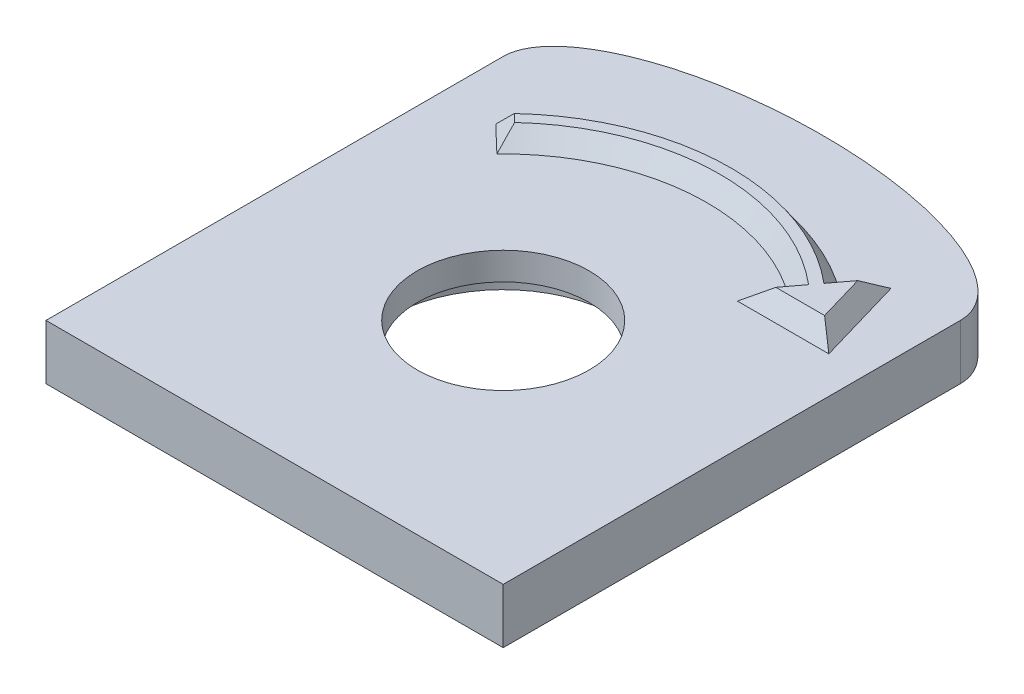
ISO-10303-21;
HEADER;
FILE_DESCRIPTION(('STEP AP214'),'2;1');
FILE_NAME('part.step','',(''),(''),'','','');
FILE_SCHEMA(('AUTOMOTIVE_DESIGN { 1 0 10303 214 1 1 1 1 }'));
ENDSEC;
DATA;
#1=APPLICATION_CONTEXT('core data for automotive mechanical design processes');
#2=APPLICATION_PROTOCOL_DEFINITION('international standard','automotive_design',2000,#1);
#3=PRODUCT_CONTEXT('',#1,'mechanical');
#4=PRODUCT('Part','Part','',(#3));
#5=PRODUCT_RELATED_PRODUCT_CATEGORY('part','',(#4));
#6=PRODUCT_DEFINITION_FORMATION('','',#4);
#7=PRODUCT_DEFINITION_CONTEXT('part definition',#1,'design');
#8=PRODUCT_DEFINITION('design','',#6,#7);
#9=PRODUCT_DEFINITION_SHAPE('','',#8);
#10=(LENGTH_UNIT() NAMED_UNIT(*) SI_UNIT(.MILLI.,.METRE.));
#11=(NAMED_UNIT(*) PLANE_ANGLE_UNIT() SI_UNIT($,.RADIAN.));
#12=(NAMED_UNIT(*) SI_UNIT($,.STERADIAN.) SOLID_ANGLE_UNIT());
#13=UNCERTAINTY_MEASURE_WITH_UNIT(LENGTH_MEASURE(1.E-05),#10,'distance_accuracy_value','');
#14=(GEOMETRIC_REPRESENTATION_CONTEXT(3) GLOBAL_UNCERTAINTY_ASSIGNED_CONTEXT((#13)) GLOBAL_UNIT_ASSIGNED_CONTEXT((#10,
#11,#12)) REPRESENTATION_CONTEXT('',''));
#15=CARTESIAN_POINT('',(0.,0.,0.));
#16=DIRECTION('',(0.,0.,1.));
#17=DIRECTION('',(1.,0.,0.));
#18=AXIS2_PLACEMENT_3D('',#15,#16,#17);
#19=CARTESIAN_POINT('',(-0.231958762886595,3.,2.60309278350516));
#20=DIRECTION('',(0.,-1.,0.));
#21=DIRECTION('',(0.,0.,-1.));
#22=AXIS2_PLACEMENT_3D('',#19,#20,#21);
#23=CYLINDRICAL_SURFACE('',#22,4.7);
#24=CARTESIAN_POINT('',(-0.231958762886595,3.,2.60309278350516));
#25=DIRECTION('',(0.,1.,0.));
#26=DIRECTION('',(0.,0.,1.));
#27=AXIS2_PLACEMENT_3D('',#24,#25,#26);
#28=CIRCLE('',#27,4.7);
#29=CARTESIAN_POINT('',(-0.231958762886595,3.,7.30309278350516));
#30=VERTEX_POINT('',#29);
#31=EDGE_CURVE('E180',#30,#30,#28,.T.);
#32=ORIENTED_EDGE('',*,*,#31,.T.);
#33=EDGE_LOOP('',(#32));
#34=FACE_BOUND('',#33,.T.);
#35=CARTESIAN_POINT('',(-0.231958762886595,1.5,2.60309278350516));
#36=DIRECTION('',(0.,-1.,0.));
#37=DIRECTION('',(0.,0.,-1.));
#38=AXIS2_PLACEMENT_3D('',#35,#36,#37);
#39=CIRCLE('',#38,4.7);
#40=CARTESIAN_POINT('',(-0.231958762886595,1.5,-2.09690721649484));
#41=VERTEX_POINT('',#40);
#42=EDGE_CURVE('E52',#41,#41,#39,.T.);
#43=ORIENTED_EDGE('',*,*,#42,.T.);
#44=EDGE_LOOP('',(#43));
#45=FACE_BOUND('',#44,.T.);
#46=ADVANCED_FACE('F47',(#34,#45),#23,.F.);
#47=CARTESIAN_POINT('',(-0.2319587628866,3.,-9.89690721649484));
#48=DIRECTION('',(0.,1.,0.));
#49=DIRECTION('',(0.,0.,1.));
#50=AXIS2_PLACEMENT_3D('',#47,#48,#49);
#51=PLANE('',#50);
#52=CARTESIAN_POINT('',(-0.2319587628866,3.,-9.89690721649484));
#53=DIRECTION('',(0.,1.,0.));
#54=DIRECTION('',(-1.,0.,0.));
#55=AXIS2_PLACEMENT_3D('',#52,#53,#54);
#56=ELLIPSE('',#55,12.5,5.);
#57=CARTESIAN_POINT('',(12.2680412371134,3.,-9.89690721649484));
#58=VERTEX_POINT('',#57);
#59=CARTESIAN_POINT('',(-12.7319587628866,3.,-9.89690721649484));
#60=VERTEX_POINT('',#59);
#61=EDGE_CURVE('E282',#58,#60,#56,.T.);
#62=ORIENTED_EDGE('',*,*,#61,.T.);
#63=DIRECTION('',(0.,0.,1.));
#64=VECTOR('',#63,1.);
#65=CARTESIAN_POINT('',(-12.7319587628866,3.,-9.89690721649484));
#66=LINE('',#65,#64);
#67=CARTESIAN_POINT('',(-12.7319587628866,3.,15.1030927835052));
#68=VERTEX_POINT('',#67);
#69=EDGE_CURVE('E299',#60,#68,#66,.T.);
#70=ORIENTED_EDGE('',*,*,#69,.T.);
#71=DIRECTION('',(1.,0.,0.));
#72=VECTOR('',#71,1.);
#73=CARTESIAN_POINT('',(-12.7319587628866,3.,15.1030927835052));
#74=LINE('',#73,#72);
#75=CARTESIAN_POINT('',(12.2680412371134,3.,15.1030927835052));
#76=VERTEX_POINT('',#75);
#77=EDGE_CURVE('E273',#68,#76,#74,.T.);
#78=ORIENTED_EDGE('',*,*,#77,.T.);
#79=DIRECTION('',(0.,0.,-1.));
#80=VECTOR('',#79,1.);
#81=CARTESIAN_POINT('',(12.2680412371134,3.,-9.89690721649484));
#82=LINE('',#81,#80);
#83=EDGE_CURVE('E290',#76,#58,#82,.T.);
#84=ORIENTED_EDGE('',*,*,#83,.T.);
#85=EDGE_LOOP('',(#62,#70,#78,#84));
#86=FACE_BOUND('',#85,.T.);
#87=ORIENTED_EDGE('',*,*,#31,.F.);
#88=EDGE_LOOP('',(#87));
#89=FACE_BOUND('',#88,.T.);
#90=DIRECTION('',(-0.599999999999999,0.,0.800000000000001));
#91=VECTOR('',#90,1.);
#92=CARTESIAN_POINT('',(1.10103092783505,3.,0.825773195876287));
#93=LINE('',#92,#91);
#94=CARTESIAN_POINT('',(6.45664947319052,3.,-6.31505153126435));
#95=VERTEX_POINT('',#94);
#96=CARTESIAN_POINT('',(5.25664947319052,3.,-4.71505153126435));
#97=VERTEX_POINT('',#96);
#98=EDGE_CURVE('E134',#95,#97,#93,.T.);
#99=ORIENTED_EDGE('',*,*,#98,.F.);
#100=CARTESIAN_POINT('',(-0.231958762886595,3.,2.60309278350516));
#101=DIRECTION('',(0.,1.,0.));
#102=DIRECTION('',(0.,0.,1.));
#103=AXIS2_PLACEMENT_3D('',#100,#101,#102);
#104=CIRCLE('',#103,11.1476803934619);
#105=CARTESIAN_POINT('',(-8.28544035923077,3.,-5.10483899694802));
#106=VERTEX_POINT('',#105);
#107=EDGE_CURVE('E65',#95,#106,#104,.T.);
#108=ORIENTED_EDGE('',*,*,#107,.T.);
#109=DIRECTION('',(0.722435637916884,0.,0.691438174436171));
#110=VECTOR('',#109,1.);
#111=CARTESIAN_POINT('',(-1.41119222121458,3.,1.47445656061417));
#112=LINE('',#111,#110);
#113=CARTESIAN_POINT('',(-9.73031163506453,3.,-6.48771534582036));
#114=VERTEX_POINT('',#113);
#115=EDGE_CURVE('E70',#114,#106,#112,.T.);
#116=ORIENTED_EDGE('',*,*,#115,.F.);
#117=CARTESIAN_POINT('',(-0.231958762886595,3.,2.60309278350516));
#118=DIRECTION('',(0.,1.,0.));
#119=DIRECTION('',(0.,0.,1.));
#120=AXIS2_PLACEMENT_3D('',#117,#118,#119);
#121=CIRCLE('',#120,13.1476803934619);
#122=CARTESIAN_POINT('',(7.65664947319052,3.,-7.91505153126435));
#123=VERTEX_POINT('',#122);
#124=EDGE_CURVE('E166',#123,#114,#121,.T.);
#125=ORIENTED_EDGE('',*,*,#124,.F.);
#126=DIRECTION('',(0.6,0.,-0.8));
#127=VECTOR('',#126,1.);
#128=CARTESIAN_POINT('',(1.10103092783504,3.,0.825773195876279));
#129=LINE('',#128,#127);
#130=CARTESIAN_POINT('',(8.85664947319052,3.,-9.51505153126435));
#131=VERTEX_POINT('',#130);
#132=EDGE_CURVE('E163',#123,#131,#129,.T.);
#133=ORIENTED_EDGE('',*,*,#132,.T.);
#134=DIRECTION('',(0.280000000000001,0.,0.96));
#135=VECTOR('',#134,1.);
#136=CARTESIAN_POINT('',(10.7199340060962,3.,-3.12664741844475));
#137=LINE('',#136,#135);
#138=CARTESIAN_POINT('',(10.2566494731905,3.,-4.71505153126435));
#139=VERTEX_POINT('',#138);
#140=EDGE_CURVE('E137',#131,#139,#137,.T.);
#141=ORIENTED_EDGE('',*,*,#140,.T.);
#142=DIRECTION('',(-1.,0.,0.));
#143=VECTOR('',#142,1.);
#144=CARTESIAN_POINT('',(0.,3.,-4.71505153126435));
#145=LINE('',#144,#143);
#146=EDGE_CURVE('E130',#139,#97,#145,.T.);
#147=ORIENTED_EDGE('',*,*,#146,.T.);
#148=EDGE_LOOP('',(#99,#108,#116,#125,#133,#141,#147));
#149=FACE_BOUND('',#148,.T.);
#150=ADVANCED_FACE('F132',(#86,#89,#149),#51,.T.);
#151=CARTESIAN_POINT('',(-0.2319587628866,0.,-9.89690721649484));
#152=DIRECTION('',(0.,1.,0.));
#153=DIRECTION('',(0.,0.,1.));
#154=AXIS2_PLACEMENT_3D('',#151,#152,#153);
#155=PLANE('',#154);
#156=CARTESIAN_POINT('',(-0.231958762886595,0.,2.60309278350516));
#157=DIRECTION('',(0.,-1.,0.));
#158=DIRECTION('',(0.,0.,-1.));
#159=AXIS2_PLACEMENT_3D('',#156,#157,#158);
#160=CIRCLE('',#159,6.3);
#161=CARTESIAN_POINT('',(-0.231958762886595,0.,-3.69690721649484));
#162=VERTEX_POINT('',#161);
#163=EDGE_CURVE('E403',#162,#162,#160,.T.);
#164=ORIENTED_EDGE('',*,*,#163,.F.);
#165=EDGE_LOOP('',(#164));
#166=FACE_BOUND('',#165,.T.);
#167=CARTESIAN_POINT('',(-0.2319587628866,0.,-9.89690721649484));
#168=DIRECTION('',(0.,1.,0.));
#169=DIRECTION('',(-1.,0.,0.));
#170=AXIS2_PLACEMENT_3D('',#167,#168,#169);
#171=ELLIPSE('',#170,12.5,5.);
#172=CARTESIAN_POINT('',(12.2680412371134,0.,-9.89690721649484));
#173=VERTEX_POINT('',#172);
#174=CARTESIAN_POINT('',(-12.7319587628866,0.,-9.89690721649484));
#175=VERTEX_POINT('',#174);
#176=EDGE_CURVE('E269',#173,#175,#171,.T.);
#177=ORIENTED_EDGE('',*,*,#176,.F.);
#178=DIRECTION('',(0.,0.,-1.));
#179=VECTOR('',#178,1.);
#180=CARTESIAN_POINT('',(12.2680412371134,0.,-9.89690721649484));
#181=LINE('',#180,#179);
#182=CARTESIAN_POINT('',(12.2680412371134,0.,15.1030927835052));
#183=VERTEX_POINT('',#182);
#184=EDGE_CURVE('E278',#183,#173,#181,.T.);
#185=ORIENTED_EDGE('',*,*,#184,.F.);
#186=DIRECTION('',(1.,0.,0.));
#187=VECTOR('',#186,1.);
#188=CARTESIAN_POINT('',(-12.7319587628866,0.,15.1030927835052));
#189=LINE('',#188,#187);
#190=CARTESIAN_POINT('',(-12.7319587628866,0.,15.1030927835052));
#191=VERTEX_POINT('',#190);
#192=EDGE_CURVE('E268',#191,#183,#189,.T.);
#193=ORIENTED_EDGE('',*,*,#192,.F.);
#194=DIRECTION('',(0.,0.,1.));
#195=VECTOR('',#194,1.);
#196=CARTESIAN_POINT('',(-12.7319587628866,0.,-9.89690721649484));
#197=LINE('',#196,#195);
#198=EDGE_CURVE('E259',#175,#191,#197,.T.);
#199=ORIENTED_EDGE('',*,*,#198,.F.);
#200=EDGE_LOOP('',(#177,#185,#193,#199));
#201=FACE_BOUND('',#200,.T.);
#202=ADVANCED_FACE('F240',(#166,#201),#155,.F.);
#203=DIRECTION('',(0.,-1.,0.));
#204=VECTOR('',#203,1.);
#205=SURFACE_OF_LINEAR_EXTRUSION('',#56,#204);
#206=ORIENTED_EDGE('',*,*,#176,.T.);
#207=DIRECTION('',(0.,-1.,0.));
#208=VECTOR('',#207,1.);
#209=CARTESIAN_POINT('',(-12.7319587628866,3.,-9.89690721649484));
#210=LINE('',#209,#208);
#211=EDGE_CURVE('E11',#60,#175,#210,.T.);
#212=ORIENTED_EDGE('',*,*,#211,.F.);
#213=ORIENTED_EDGE('',*,*,#61,.F.);
#214=DIRECTION('',(0.,-1.,0.));
#215=VECTOR('',#214,1.);
#216=CARTESIAN_POINT('',(12.2680412371134,3.,-9.89690721649484));
#217=LINE('',#216,#215);
#218=EDGE_CURVE('E286',#58,#173,#217,.T.);
#219=ORIENTED_EDGE('',*,*,#218,.T.);
#220=EDGE_LOOP('',(#206,#212,#213,#219));
#221=FACE_BOUND('',#220,.T.);
#222=ADVANCED_FACE('F49',(#221),#205,.F.);
#223=CARTESIAN_POINT('',(-12.7319587628866,3.,-9.89690721649484));
#224=DIRECTION('',(1.,0.,0.));
#225=DIRECTION('',(0.,0.,-1.));
#226=AXIS2_PLACEMENT_3D('',#223,#224,#225);
#227=PLANE('',#226);
#228=ORIENTED_EDGE('',*,*,#198,.T.);
#229=DIRECTION('',(0.,-1.,0.));
#230=VECTOR('',#229,1.);
#231=CARTESIAN_POINT('',(-12.7319587628866,3.,15.1030927835052));
#232=LINE('',#231,#230);
#233=EDGE_CURVE('E58',#68,#191,#232,.T.);
#234=ORIENTED_EDGE('',*,*,#233,.F.);
#235=ORIENTED_EDGE('',*,*,#69,.F.);
#236=ORIENTED_EDGE('',*,*,#211,.T.);
#237=EDGE_LOOP('',(#228,#234,#235,#236));
#238=FACE_BOUND('',#237,.T.);
#239=ADVANCED_FACE('F250',(#238),#227,.F.);
#240=CARTESIAN_POINT('',(-12.7319587628866,3.,15.1030927835052));
#241=DIRECTION('',(0.,0.,-1.));
#242=DIRECTION('',(-1.,0.,0.));
#243=AXIS2_PLACEMENT_3D('',#240,#241,#242);
#244=PLANE('',#243);
#245=ORIENTED_EDGE('',*,*,#192,.T.);
#246=DIRECTION('',(0.,-1.,0.));
#247=VECTOR('',#246,1.);
#248=CARTESIAN_POINT('',(12.2680412371134,3.,15.1030927835052));
#249=LINE('',#248,#247);
#250=EDGE_CURVE('E275',#76,#183,#249,.T.);
#251=ORIENTED_EDGE('',*,*,#250,.F.);
#252=ORIENTED_EDGE('',*,*,#77,.F.);
#253=ORIENTED_EDGE('',*,*,#233,.T.);
#254=EDGE_LOOP('',(#245,#251,#252,#253));
#255=FACE_BOUND('',#254,.T.);
#256=ADVANCED_FACE('F247',(#255),#244,.F.);
#257=CARTESIAN_POINT('',(12.2680412371134,3.,-9.89690721649484));
#258=DIRECTION('',(-1.,0.,0.));
#259=DIRECTION('',(0.,0.,1.));
#260=AXIS2_PLACEMENT_3D('',#257,#258,#259);
#261=PLANE('',#260);
#262=ORIENTED_EDGE('',*,*,#184,.T.);
#263=ORIENTED_EDGE('',*,*,#218,.F.);
#264=ORIENTED_EDGE('',*,*,#83,.F.);
#265=ORIENTED_EDGE('',*,*,#250,.T.);
#266=EDGE_LOOP('',(#262,#263,#264,#265));
#267=FACE_BOUND('',#266,.T.);
#268=ADVANCED_FACE('F193',(#267),#261,.F.);
#269=CARTESIAN_POINT('',(-0.231958762886595,3.,2.60309278350516));
#270=DIRECTION('',(0.,1.,0.));
#271=DIRECTION('',(0.,0.,1.));
#272=AXIS2_PLACEMENT_3D('',#269,#270,#271);
#273=CONICAL_SURFACE('',#272,11.1476803934619,0.610865238198017);
#274=ORIENTED_EDGE('',*,*,#107,.F.);
#275=CARTESIAN_POINT('',(7.42451453443322,4.,-6.4385257159051));
#276=CARTESIAN_POINT('',(7.34429246735843,3.91609931025148,-6.42947611884356));
#277=CARTESIAN_POINT('',(7.2639645185488,3.83233162483248,-6.42013012841199));
#278=CARTESIAN_POINT('',(7.10309580612687,3.66507809354668,-6.40082548418027));
#279=CARTESIAN_POINT('',(7.02255505104278,3.58159223668207,-6.39086685458565));
#280=CARTESIAN_POINT('',(6.86125309240083,3.4149113096481,-6.37031631237133));
#281=CARTESIAN_POINT('',(6.78049188816617,3.33171624037329,-6.35972439780528));
#282=CARTESIAN_POINT('',(6.61874176328117,3.16562766256087,-6.33788502161659));
#283=CARTESIAN_POINT('',(6.53775283376476,3.08273416606093,-6.3266375341244));
#284=CARTESIAN_POINT('',(6.45664947319052,3.,-6.31505153126435));
#285=B_SPLINE_CURVE_WITH_KNOTS('',3,(#275,#276,#277,#278,#279,#280,#281,#282,#283,#284),
.UNSPECIFIED.,.F.,.F.,(4,2,2,2,4),(0.,0.349300739301151,0.698587686502289,1.04787570726555,
1.39717752062039),.UNSPECIFIED.);
#286=CARTESIAN_POINT('',(7.42451453443322,4.,-6.4385257159051));
#287=VERTEX_POINT('',#286);
#288=EDGE_CURVE('E151',#287,#95,#285,.T.);
#289=ORIENTED_EDGE('',*,*,#288,.F.);
#290=CARTESIAN_POINT('',(-0.231958762886595,4.,2.60309278350516));
#291=DIRECTION('',(0.,1.,0.));
#292=DIRECTION('',(0.,0.,1.));
#293=AXIS2_PLACEMENT_3D('',#290,#291,#292);
#294=CIRCLE('',#293,11.8478879316716);
#295=CARTESIAN_POINT('',(-8.29218398612416,4.,-6.08052499897088));
#296=VERTEX_POINT('',#295);
#297=EDGE_CURVE('E171',#287,#296,#294,.T.);
#298=ORIENTED_EDGE('',*,*,#297,.T.);
#299=CARTESIAN_POINT('',(-8.29218398612416,4.,-6.08052499897088));
#300=CARTESIAN_POINT('',(-8.2928011544252,3.91609931025148,-5.99979647640286));
#301=CARTESIAN_POINT('',(-8.2931367329007,3.83233162483248,-5.9189273581673));
#302=CARTESIAN_POINT('',(-8.29322510229012,3.66507809354668,-5.75690450756883));
#303=CARTESIAN_POINT('',(-8.29297791621482,3.58159223668207,-5.67575078656996));
#304=CARTESIAN_POINT('',(-8.29188119873996,3.4149113096481,-5.51314868369976));
#305=CARTESIAN_POINT('',(-8.29103166548903,3.33171624037329,-5.43170030092353));
#306=CARTESIAN_POINT('',(-8.28870901957211,3.16562766256087,-5.26849899403977));
#307=CARTESIAN_POINT('',(-8.28723588228371,3.08273416606093,-5.18674605803358));
#308=CARTESIAN_POINT('',(-8.28544035923077,3.,-5.10483899694802));
#309=B_SPLINE_CURVE_WITH_KNOTS('',3,(#299,#300,#301,#302,#303,#304,#305,#306,#307,#308),
.UNSPECIFIED.,.F.,.F.,(4,2,2,2,4),(0.,0.34930073930115,0.698587686502288,1.04787570726554,
1.39717752062039),.UNSPECIFIED.);
#310=EDGE_CURVE('E181',#296,#106,#309,.T.);
#311=ORIENTED_EDGE('',*,*,#310,.T.);
#312=EDGE_LOOP('',(#274,#289,#298,#311));
#313=FACE_BOUND('',#312,.T.);
#314=ADVANCED_FACE('F190',(#313),#273,.F.);
#315=CARTESIAN_POINT('',(1.10103092783505,3.,0.825773195876287));
#316=DIRECTION('',(-0.655321635431193,0.573576436351047,-0.491491226573394));
#317=DIRECTION('',(-0.658615162419438,-0.752479945135562,0.));
#318=AXIS2_PLACEMENT_3D('',#315,#316,#317);
#319=PLANE('',#318);
#320=ORIENTED_EDGE('',*,*,#98,.T.);
#321=DIRECTION('',(0.753799416236219,0.538268566890562,-0.37689970811811));
#322=VECTOR('',#321,1.);
#323=CARTESIAN_POINT('',(1.32118479432725,0.189786981638717,-2.74731919183271));
#324=LINE('',#323,#322);
#325=CARTESIAN_POINT('',(6.65706454960994,4.,-5.41525906947406));
#326=VERTEX_POINT('',#325);
#327=EDGE_CURVE('E144',#326,#97,#324,.F.);
#328=ORIENTED_EDGE('',*,*,#327,.F.);
#329=DIRECTION('',(0.599999999999999,0.,-0.800000000000001));
#330=VECTOR('',#329,1.);
#331=CARTESIAN_POINT('',(1.66119695840282,4.,1.24589771880211));
#332=LINE('',#331,#330);
#333=EDGE_CURVE('E328',#287,#326,#332,.F.);
#334=ORIENTED_EDGE('',*,*,#333,.F.);
#335=ORIENTED_EDGE('',*,*,#288,.T.);
#336=EDGE_LOOP('',(#320,#328,#334,#335));
#337=FACE_BOUND('',#336,.T.);
#338=ADVANCED_FACE('F154',(#337),#319,.T.);
#339=CARTESIAN_POINT('',(0.,3.,-4.71505153126435));
#340=DIRECTION('',(0.,0.573576436351047,0.819152044288991));
#341=DIRECTION('',(0.,-0.819152044288991,0.573576436351047));
#342=AXIS2_PLACEMENT_3D('',#339,#340,#341);
#343=PLANE('',#342);
#344=ORIENTED_EDGE('',*,*,#146,.F.);
#345=DIRECTION('',(0.607481533820618,-0.650680156243917,0.455611150365464));
#346=VECTOR('',#345,1.);
#347=CARTESIAN_POINT('',(10.8672482521705,2.34598092816045,-4.25710244702938));
#348=LINE('',#347,#346);
#349=CARTESIAN_POINT('',(9.32303942224424,4.,-5.41525906947406));
#350=VERTEX_POINT('',#349);
#351=EDGE_CURVE('E152',#350,#139,#348,.T.);
#352=ORIENTED_EDGE('',*,*,#351,.F.);
#353=DIRECTION('',(-1.,0.,0.));
#354=VECTOR('',#353,1.);
#355=CARTESIAN_POINT('',(0.,4.,-5.41525906947406));
#356=LINE('',#355,#354);
#357=EDGE_CURVE('E147',#350,#326,#356,.T.);
#358=ORIENTED_EDGE('',*,*,#357,.T.);
#359=ORIENTED_EDGE('',*,*,#327,.T.);
#360=EDGE_LOOP('',(#344,#352,#358,#359));
#361=FACE_BOUND('',#360,.T.);
#362=ADVANCED_FACE('F145',(#361),#343,.T.);
#363=CARTESIAN_POINT('',(10.7199340060962,3.,-3.12664741844475));
#364=DIRECTION('',(0.786385962517431,0.573576436351047,-0.229362572400918));
#365=DIRECTION('',(-0.589286184007011,0.807924373526666,0.));
#366=AXIS2_PLACEMENT_3D('',#363,#364,#365);
#367=PLANE('',#366);
#368=ORIENTED_EDGE('',*,*,#140,.F.);
#369=DIRECTION('',(0.150759883247244,-0.538268566890562,-0.829179357859841));
#370=VECTOR('',#369,1.);
#371=CARTESIAN_POINT('',(7.38770026551619,8.24469220736375,-1.43583088905553));
#372=LINE('',#371,#370);
#373=CARTESIAN_POINT('',(8.57656645790663,4.,-7.97459494720299));
#374=VERTEX_POINT('',#373);
#375=EDGE_CURVE('E222',#374,#131,#372,.T.);
#376=ORIENTED_EDGE('',*,*,#375,.F.);
#377=DIRECTION('',(0.280000000000001,0.,0.96));
#378=VECTOR('',#377,1.);
#379=CARTESIAN_POINT('',(10.0477347694149,4.,-2.93058930774603));
#380=LINE('',#379,#378);
#381=EDGE_CURVE('E322',#374,#350,#380,.T.);
#382=ORIENTED_EDGE('',*,*,#381,.T.);
#383=ORIENTED_EDGE('',*,*,#351,.T.);
#384=EDGE_LOOP('',(#368,#376,#382,#383));
#385=FACE_BOUND('',#384,.T.);
#386=ADVANCED_FACE('F228',(#385),#367,.T.);
#387=CARTESIAN_POINT('',(1.10103092783504,3.,0.825773195876279));
#388=DIRECTION('',(-0.655321635431193,0.573576436351047,-0.491491226573395));
#389=DIRECTION('',(-0.658615162419438,-0.752479945135561,0.));
#390=AXIS2_PLACEMENT_3D('',#387,#388,#389);
#391=PLANE('',#390);
#392=ORIENTED_EDGE('',*,*,#132,.F.);
#393=CARTESIAN_POINT('',(7.78486498805713,4.,-6.91899298740365));
#394=CARTESIAN_POINT('',(7.77529464379147,3.91728747828569,-7.00275908039727));
#395=CARTESIAN_POINT('',(7.76543369155182,3.83441062082348,-7.08632947797468));
#396=CARTESIAN_POINT('',(7.74514908137049,3.66834458353217,-7.25308448298623));
#397=CARTESIAN_POINT('',(7.73472544478108,3.58515541566566,-7.33626910492955));
#398=CARTESIAN_POINT('',(7.71333327611919,3.41847505412414,-7.50226428941852));
#399=CARTESIAN_POINT('',(7.7023647455011,3.33498386125582,-7.58507485296193));
#400=CARTESIAN_POINT('',(7.67989918995697,3.16770813743391,-7.75033365020241));
#401=CARTESIAN_POINT('',(7.6684021450057,3.08392359547671,-7.8327818700405));
#402=CARTESIAN_POINT('',(7.65664947319052,3.,-7.91505153126435));
#403=B_SPLINE_CURVE_WITH_KNOTS('',3,(#393,#394,#395,#396,#397,#398,#399,#400,#401,#402),
.UNSPECIFIED.,.F.,.F.,(4,2,2,2,4),(0.,0.354325821605033,0.708638206999256,1.06294964674811,
1.41727452233042),.UNSPECIFIED.);
#404=CARTESIAN_POINT('',(7.78486498805713,4.,-6.91899298740365));
#405=VERTEX_POINT('',#404);
#406=EDGE_CURVE('E214',#405,#123,#403,.T.);
#407=ORIENTED_EDGE('',*,*,#406,.F.);
#408=DIRECTION('',(0.6,0.,-0.8));
#409=VECTOR('',#408,1.);
#410=CARTESIAN_POINT('',(1.66119695840281,4.,1.24589771880211));
#411=LINE('',#410,#409);
#412=EDGE_CURVE('E318',#405,#374,#411,.T.);
#413=ORIENTED_EDGE('',*,*,#412,.T.);
#414=ORIENTED_EDGE('',*,*,#375,.T.);
#415=EDGE_LOOP('',(#392,#407,#413,#414));
#416=FACE_BOUND('',#415,.T.);
#417=ADVANCED_FACE('F224',(#416),#391,.T.);
#418=CARTESIAN_POINT('',(-0.231958762886595,3.,2.60309278350516));
#419=DIRECTION('',(0.,-1.,0.));
#420=DIRECTION('',(0.,0.,1.));
#421=AXIS2_PLACEMENT_3D('',#418,#419,#420);
#422=CONICAL_SURFACE('',#421,13.1476803934619,0.610865238198017);
#423=ORIENTED_EDGE('',*,*,#124,.T.);
#424=CARTESIAN_POINT('',(-8.72606733585321,4.,-6.49579176532249));
#425=CARTESIAN_POINT('',(-8.81037673560226,3.91728747828569,-6.49631611132885));
#426=CARTESIAN_POINT('',(-8.89452662933159,3.83441062082348,-6.49652851580198));
#427=CARTESIAN_POINT('',(-9.06251074970324,3.66834458353217,-6.49634848920704));
#428=CARTESIAN_POINT('',(-9.1463449881948,3.58515541566566,-6.49595608107434));
#429=CARTESIAN_POINT('',(-9.31370731281892,3.41847505412414,-6.49458551549946));
#430=CARTESIAN_POINT('',(-9.397235399768,3.33498386125582,-6.49360735962063));
#431=CARTESIAN_POINT('',(-9.56399510349682,3.16770813743391,-6.49108298572751));
#432=CARTESIAN_POINT('',(-9.64722670891401,3.08392359547671,-6.48953674617316));
#433=CARTESIAN_POINT('',(-9.73031163506453,3.,-6.48771534582036));
#434=B_SPLINE_CURVE_WITH_KNOTS('',3,(#424,#425,#426,#427,#428,#429,#430,#431,#432,#433),
.UNSPECIFIED.,.F.,.F.,(4,2,2,2,4),(0.,0.354325821605034,0.708638206999257,1.06294964674811,
1.41727452233042),.UNSPECIFIED.);
#435=CARTESIAN_POINT('',(-8.72606733585321,4.,-6.49579176532249));
#436=VERTEX_POINT('',#435);
#437=EDGE_CURVE('E206',#436,#114,#434,.T.);
#438=ORIENTED_EDGE('',*,*,#437,.F.);
#439=CARTESIAN_POINT('',(-0.231958762886595,4.,2.60309278350516));
#440=DIRECTION('',(0.,1.,0.));
#441=DIRECTION('',(0.,0.,1.));
#442=AXIS2_PLACEMENT_3D('',#439,#440,#441);
#443=CIRCLE('',#442,12.4474728552522);
#444=EDGE_CURVE('E315',#405,#436,#443,.T.);
#445=ORIENTED_EDGE('',*,*,#444,.F.);
#446=ORIENTED_EDGE('',*,*,#406,.T.);
#447=EDGE_LOOP('',(#423,#438,#445,#446));
#448=FACE_BOUND('',#447,.T.);
#449=ADVANCED_FACE('F201',(#448),#422,.T.);
#450=CARTESIAN_POINT('',(-1.41119222121458,3.,1.47445656061417));
#451=DIRECTION('',(-0.566392994088837,0.573576436351047,0.591784629666837));
#452=DIRECTION('',(0.,-0.718067332921167,0.695973638431429));
#453=AXIS2_PLACEMENT_3D('',#450,#451,#452);
#454=PLANE('',#453);
#455=ORIENTED_EDGE('',*,*,#115,.T.);
#456=ORIENTED_EDGE('',*,*,#310,.F.);
#457=DIRECTION('',(-0.722435637916884,0.,-0.691438174436171));
#458=VECTOR('',#457,1.);
#459=CARTESIAN_POINT('',(-0.927041999268408,4.,0.968601681073426));
#460=LINE('',#459,#458);
#461=EDGE_CURVE('E308',#436,#296,#460,.F.);
#462=ORIENTED_EDGE('',*,*,#461,.F.);
#463=ORIENTED_EDGE('',*,*,#437,.T.);
#464=EDGE_LOOP('',(#455,#456,#462,#463));
#465=FACE_BOUND('',#464,.T.);
#466=ADVANCED_FACE('F195',(#465),#454,.T.);
#467=CARTESIAN_POINT('',(0.,4.,0.));
#468=DIRECTION('',(0.,1.,0.));
#469=DIRECTION('',(0.,0.,1.));
#470=AXIS2_PLACEMENT_3D('',#467,#468,#469);
#471=PLANE('',#470);
#472=ORIENTED_EDGE('',*,*,#297,.F.);
#473=ORIENTED_EDGE('',*,*,#333,.T.);
#474=ORIENTED_EDGE('',*,*,#357,.F.);
#475=ORIENTED_EDGE('',*,*,#381,.F.);
#476=ORIENTED_EDGE('',*,*,#412,.F.);
#477=ORIENTED_EDGE('',*,*,#444,.T.);
#478=ORIENTED_EDGE('',*,*,#461,.T.);
#479=EDGE_LOOP('',(#472,#473,#474,#475,#476,#477,#478));
#480=FACE_BOUND('',#479,.T.);
#481=ADVANCED_FACE('F200',(#480),#471,.T.);
#482=CARTESIAN_POINT('',(-0.231958762886595,1.5,2.60309278350516));
#483=DIRECTION('',(0.,-1.,0.));
#484=DIRECTION('',(0.,0.,-1.));
#485=AXIS2_PLACEMENT_3D('',#482,#483,#484);
#486=CYLINDRICAL_SURFACE('',#485,6.3);
#487=CARTESIAN_POINT('',(-0.231958762886595,1.5,2.60309278350516));
#488=DIRECTION('',(0.,-1.,0.));
#489=DIRECTION('',(0.,0.,-1.));
#490=AXIS2_PLACEMENT_3D('',#487,#488,#489);
#491=CIRCLE('',#490,6.3);
#492=CARTESIAN_POINT('',(-0.231958762886595,1.5,-3.69690721649484));
#493=VERTEX_POINT('',#492);
#494=EDGE_CURVE('E401',#493,#493,#491,.T.);
#495=ORIENTED_EDGE('',*,*,#494,.F.);
#496=EDGE_LOOP('',(#495));
#497=FACE_BOUND('',#496,.T.);
#498=ORIENTED_EDGE('',*,*,#163,.T.);
#499=EDGE_LOOP('',(#498));
#500=FACE_BOUND('',#499,.T.);
#501=ADVANCED_FACE('F363',(#497,#500),#486,.F.);
#502=CARTESIAN_POINT('',(-0.231958762886595,1.5,2.60309278350516));
#503=DIRECTION('',(0.,-1.,0.));
#504=DIRECTION('',(0.,0.,-1.));
#505=AXIS2_PLACEMENT_3D('',#502,#503,#504);
#506=PLANE('',#505);
#507=ORIENTED_EDGE('',*,*,#42,.F.);
#508=EDGE_LOOP('',(#507));
#509=FACE_BOUND('',#508,.T.);
#510=ORIENTED_EDGE('',*,*,#494,.T.);
#511=EDGE_LOOP('',(#510));
#512=FACE_BOUND('',#511,.T.);
#513=ADVANCED_FACE('F382',(#509,#512),#506,.T.);
#514=CLOSED_SHELL('',(#46,#150,#202,#222,#239,#256,#268,#314,#338,#362,#386,#417,#449,#466,#481,
#501,#513));
#515=MANIFOLD_SOLID_BREP('B2',#514);
#516=ADVANCED_BREP_SHAPE_REPRESENTATION('',(#18,#515),#14);
#517=SHAPE_DEFINITION_REPRESENTATION(#9,#516);
ENDSEC;
END-ISO-10303-21;
